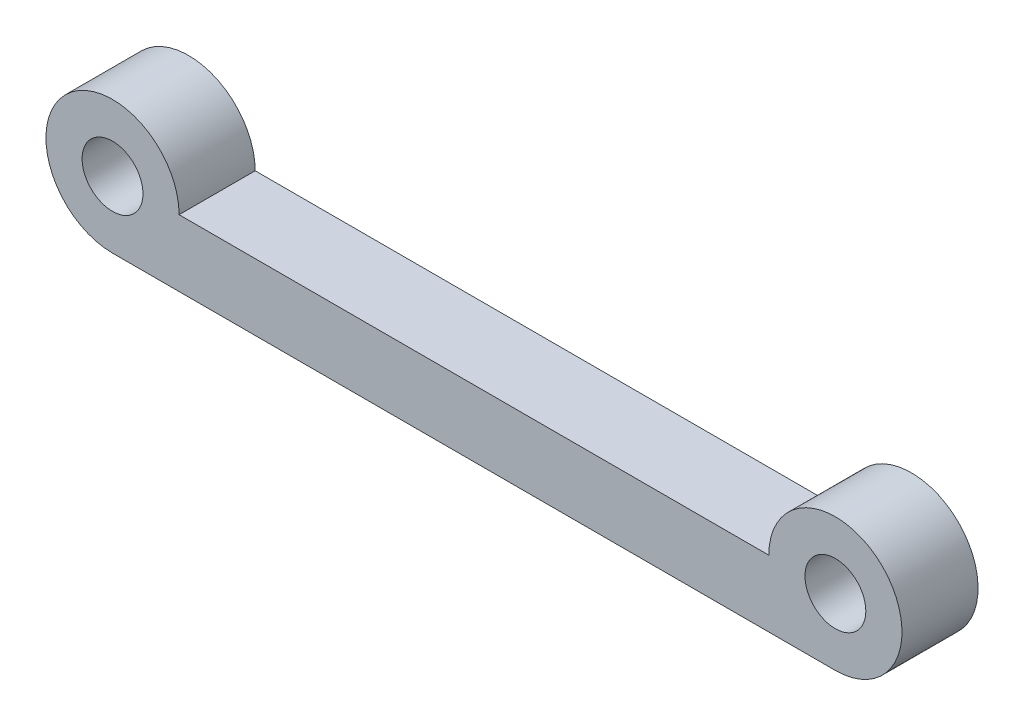
ISO-10303-21;
HEADER;
FILE_DESCRIPTION(('STEP AP214'),'2;1');
FILE_NAME('part.step','',(''),(''),'','','');
FILE_SCHEMA(('AUTOMOTIVE_DESIGN { 1 0 10303 214 1 1 1 1 }'));
ENDSEC;
DATA;
#1=APPLICATION_CONTEXT('core data for automotive mechanical design processes');
#2=APPLICATION_PROTOCOL_DEFINITION('international standard','automotive_design',2000,#1);
#3=PRODUCT_CONTEXT('',#1,'mechanical');
#4=PRODUCT('Part','Part','',(#3));
#5=PRODUCT_RELATED_PRODUCT_CATEGORY('part','',(#4));
#6=PRODUCT_DEFINITION_FORMATION('','',#4);
#7=PRODUCT_DEFINITION_CONTEXT('part definition',#1,'design');
#8=PRODUCT_DEFINITION('design','',#6,#7);
#9=PRODUCT_DEFINITION_SHAPE('','',#8);
#10=(LENGTH_UNIT() NAMED_UNIT(*) SI_UNIT(.MILLI.,.METRE.));
#11=(NAMED_UNIT(*) PLANE_ANGLE_UNIT() SI_UNIT($,.RADIAN.));
#12=(NAMED_UNIT(*) SI_UNIT($,.STERADIAN.) SOLID_ANGLE_UNIT());
#13=UNCERTAINTY_MEASURE_WITH_UNIT(LENGTH_MEASURE(1.E-05),#10,'distance_accuracy_value','');
#14=(GEOMETRIC_REPRESENTATION_CONTEXT(3) GLOBAL_UNCERTAINTY_ASSIGNED_CONTEXT((#13)) GLOBAL_UNIT_ASSIGNED_CONTEXT((#10,
#11,#12)) REPRESENTATION_CONTEXT('',''));
#15=CARTESIAN_POINT('',(0.,0.,0.));
#16=DIRECTION('',(0.,0.,1.));
#17=DIRECTION('',(1.,0.,0.));
#18=AXIS2_PLACEMENT_3D('',#15,#16,#17);
#19=CARTESIAN_POINT('',(0.,0.,4.));
#20=DIRECTION('',(0.,0.,1.));
#21=DIRECTION('',(1.,0.,0.));
#22=AXIS2_PLACEMENT_3D('',#19,#20,#21);
#23=PLANE('',#22);
#24=CARTESIAN_POINT('',(0.,0.,4.));
#25=DIRECTION('',(0.,0.,1.));
#26=DIRECTION('',(1.,0.,0.));
#27=AXIS2_PLACEMENT_3D('',#24,#25,#26);
#28=CIRCLE('',#27,1.6);
#29=CARTESIAN_POINT('',(1.6,0.,4.));
#30=VERTEX_POINT('',#29);
#31=EDGE_CURVE('E100',#30,#30,#28,.T.);
#32=ORIENTED_EDGE('',*,*,#31,.F.);
#33=EDGE_LOOP('',(#32));
#34=FACE_BOUND('',#33,.T.);
#35=CARTESIAN_POINT('',(0.,0.,4.));
#36=DIRECTION('',(0.,0.,1.));
#37=DIRECTION('',(1.,0.,0.));
#38=AXIS2_PLACEMENT_3D('',#35,#36,#37);
#39=CIRCLE('',#38,3.5);
#40=CARTESIAN_POINT('',(3.5,0.,4.));
#41=VERTEX_POINT('',#40);
#42=CARTESIAN_POINT('',(0.,-3.5,4.));
#43=VERTEX_POINT('',#42);
#44=EDGE_CURVE('E85',#41,#43,#39,.T.);
#45=ORIENTED_EDGE('',*,*,#44,.T.);
#46=DIRECTION('',(1.,0.,0.));
#47=VECTOR('',#46,1.);
#48=CARTESIAN_POINT('',(0.,-3.5,4.));
#49=LINE('',#48,#47);
#50=CARTESIAN_POINT('',(38.,-3.5,4.));
#51=VERTEX_POINT('',#50);
#52=EDGE_CURVE('E80',#43,#51,#49,.T.);
#53=ORIENTED_EDGE('',*,*,#52,.T.);
#54=CARTESIAN_POINT('',(38.,0.,4.));
#55=DIRECTION('',(0.,0.,1.));
#56=DIRECTION('',(1.,0.,0.));
#57=AXIS2_PLACEMENT_3D('',#54,#55,#56);
#58=CIRCLE('',#57,3.5);
#59=CARTESIAN_POINT('',(34.5,0.,4.));
#60=VERTEX_POINT('',#59);
#61=EDGE_CURVE('E83',#51,#60,#58,.T.);
#62=ORIENTED_EDGE('',*,*,#61,.T.);
#63=DIRECTION('',(-1.,0.,0.));
#64=VECTOR('',#63,1.);
#65=CARTESIAN_POINT('',(3.5,0.,4.));
#66=LINE('',#65,#64);
#67=EDGE_CURVE('E50',#60,#41,#66,.T.);
#68=ORIENTED_EDGE('',*,*,#67,.T.);
#69=EDGE_LOOP('',(#45,#53,#62,#68));
#70=FACE_BOUND('',#69,.T.);
#71=CARTESIAN_POINT('',(38.,0.,4.));
#72=DIRECTION('',(0.,0.,1.));
#73=DIRECTION('',(1.,0.,0.));
#74=AXIS2_PLACEMENT_3D('',#71,#72,#73);
#75=CIRCLE('',#74,1.6);
#76=CARTESIAN_POINT('',(39.6,0.,4.));
#77=VERTEX_POINT('',#76);
#78=EDGE_CURVE('E115',#77,#77,#75,.T.);
#79=ORIENTED_EDGE('',*,*,#78,.F.);
#80=EDGE_LOOP('',(#79));
#81=FACE_BOUND('',#80,.T.);
#82=ADVANCED_FACE('F33',(#34,#70,#81),#23,.T.);
#83=CARTESIAN_POINT('',(0.,0.,0.));
#84=DIRECTION('',(0.,0.,1.));
#85=DIRECTION('',(1.,0.,0.));
#86=AXIS2_PLACEMENT_3D('',#83,#84,#85);
#87=PLANE('',#86);
#88=CARTESIAN_POINT('',(0.,0.,0.));
#89=DIRECTION('',(0.,0.,1.));
#90=DIRECTION('',(1.,0.,0.));
#91=AXIS2_PLACEMENT_3D('',#88,#89,#90);
#92=CIRCLE('',#91,3.5);
#93=CARTESIAN_POINT('',(3.5,0.,0.));
#94=VERTEX_POINT('',#93);
#95=CARTESIAN_POINT('',(0.,-3.5,0.));
#96=VERTEX_POINT('',#95);
#97=EDGE_CURVE('E97',#94,#96,#92,.T.);
#98=ORIENTED_EDGE('',*,*,#97,.F.);
#99=DIRECTION('',(-1.,0.,0.));
#100=VECTOR('',#99,1.);
#101=CARTESIAN_POINT('',(3.5,0.,0.));
#102=LINE('',#101,#100);
#103=CARTESIAN_POINT('',(34.5,0.,0.));
#104=VERTEX_POINT('',#103);
#105=EDGE_CURVE('E73',#104,#94,#102,.T.);
#106=ORIENTED_EDGE('',*,*,#105,.F.);
#107=CARTESIAN_POINT('',(38.,0.,0.));
#108=DIRECTION('',(0.,0.,1.));
#109=DIRECTION('',(1.,0.,0.));
#110=AXIS2_PLACEMENT_3D('',#107,#108,#109);
#111=CIRCLE('',#110,3.5);
#112=CARTESIAN_POINT('',(38.,-3.5,0.));
#113=VERTEX_POINT('',#112);
#114=EDGE_CURVE('E67',#113,#104,#111,.T.);
#115=ORIENTED_EDGE('',*,*,#114,.F.);
#116=DIRECTION('',(1.,0.,0.));
#117=VECTOR('',#116,1.);
#118=CARTESIAN_POINT('',(0.,-3.5,0.));
#119=LINE('',#118,#117);
#120=EDGE_CURVE('E89',#96,#113,#119,.T.);
#121=ORIENTED_EDGE('',*,*,#120,.F.);
#122=EDGE_LOOP('',(#98,#106,#115,#121));
#123=FACE_BOUND('',#122,.T.);
#124=CARTESIAN_POINT('',(0.,0.,0.));
#125=DIRECTION('',(0.,0.,1.));
#126=DIRECTION('',(1.,0.,0.));
#127=AXIS2_PLACEMENT_3D('',#124,#125,#126);
#128=CIRCLE('',#127,1.6);
#129=CARTESIAN_POINT('',(1.6,0.,0.));
#130=VERTEX_POINT('',#129);
#131=EDGE_CURVE('E112',#130,#130,#128,.T.);
#132=ORIENTED_EDGE('',*,*,#131,.T.);
#133=EDGE_LOOP('',(#132));
#134=FACE_BOUND('',#133,.T.);
#135=CARTESIAN_POINT('',(38.,0.,0.));
#136=DIRECTION('',(0.,0.,1.));
#137=DIRECTION('',(1.,0.,0.));
#138=AXIS2_PLACEMENT_3D('',#135,#136,#137);
#139=CIRCLE('',#138,1.6);
#140=CARTESIAN_POINT('',(39.6,0.,0.));
#141=VERTEX_POINT('',#140);
#142=EDGE_CURVE('E118',#141,#141,#139,.T.);
#143=ORIENTED_EDGE('',*,*,#142,.T.);
#144=EDGE_LOOP('',(#143));
#145=FACE_BOUND('',#144,.T.);
#146=ADVANCED_FACE('F108',(#123,#134,#145),#87,.F.);
#147=CARTESIAN_POINT('',(0.,0.,4.));
#148=DIRECTION('',(0.,0.,-1.));
#149=DIRECTION('',(-1.,0.,0.));
#150=AXIS2_PLACEMENT_3D('',#147,#148,#149);
#151=CYLINDRICAL_SURFACE('',#150,3.5);
#152=ORIENTED_EDGE('',*,*,#97,.T.);
#153=DIRECTION('',(0.,0.,-1.));
#154=VECTOR('',#153,1.);
#155=CARTESIAN_POINT('',(0.,-3.5,4.));
#156=LINE('',#155,#154);
#157=EDGE_CURVE('E11',#43,#96,#156,.T.);
#158=ORIENTED_EDGE('',*,*,#157,.F.);
#159=ORIENTED_EDGE('',*,*,#44,.F.);
#160=DIRECTION('',(0.,0.,-1.));
#161=VECTOR('',#160,1.);
#162=CARTESIAN_POINT('',(3.5,0.,4.));
#163=LINE('',#162,#161);
#164=EDGE_CURVE('E93',#41,#94,#163,.T.);
#165=ORIENTED_EDGE('',*,*,#164,.T.);
#166=EDGE_LOOP('',(#152,#158,#159,#165));
#167=FACE_BOUND('',#166,.T.);
#168=ADVANCED_FACE('F35',(#167),#151,.T.);
#169=CARTESIAN_POINT('',(0.,-3.5,4.));
#170=DIRECTION('',(0.,1.,0.));
#171=DIRECTION('',(0.,0.,1.));
#172=AXIS2_PLACEMENT_3D('',#169,#170,#171);
#173=PLANE('',#172);
#174=ORIENTED_EDGE('',*,*,#120,.T.);
#175=DIRECTION('',(0.,0.,-1.));
#176=VECTOR('',#175,1.);
#177=CARTESIAN_POINT('',(38.,-3.5,4.));
#178=LINE('',#177,#176);
#179=EDGE_CURVE('E42',#51,#113,#178,.T.);
#180=ORIENTED_EDGE('',*,*,#179,.F.);
#181=ORIENTED_EDGE('',*,*,#52,.F.);
#182=ORIENTED_EDGE('',*,*,#157,.T.);
#183=EDGE_LOOP('',(#174,#180,#181,#182));
#184=FACE_BOUND('',#183,.T.);
#185=ADVANCED_FACE('F88',(#184),#173,.F.);
#186=CARTESIAN_POINT('',(38.,0.,4.));
#187=DIRECTION('',(0.,0.,-1.));
#188=DIRECTION('',(-1.,0.,0.));
#189=AXIS2_PLACEMENT_3D('',#186,#187,#188);
#190=CYLINDRICAL_SURFACE('',#189,3.5);
#191=ORIENTED_EDGE('',*,*,#114,.T.);
#192=DIRECTION('',(0.,0.,-1.));
#193=VECTOR('',#192,1.);
#194=CARTESIAN_POINT('',(34.5,0.,4.));
#195=LINE('',#194,#193);
#196=EDGE_CURVE('E90',#60,#104,#195,.T.);
#197=ORIENTED_EDGE('',*,*,#196,.F.);
#198=ORIENTED_EDGE('',*,*,#61,.F.);
#199=ORIENTED_EDGE('',*,*,#179,.T.);
#200=EDGE_LOOP('',(#191,#197,#198,#199));
#201=FACE_BOUND('',#200,.T.);
#202=ADVANCED_FACE('F91',(#201),#190,.T.);
#203=CARTESIAN_POINT('',(3.5,0.,4.));
#204=DIRECTION('',(0.,-1.,0.));
#205=DIRECTION('',(1.,0.,0.));
#206=AXIS2_PLACEMENT_3D('',#203,#204,#205);
#207=PLANE('',#206);
#208=ORIENTED_EDGE('',*,*,#105,.T.);
#209=ORIENTED_EDGE('',*,*,#164,.F.);
#210=ORIENTED_EDGE('',*,*,#67,.F.);
#211=ORIENTED_EDGE('',*,*,#196,.T.);
#212=EDGE_LOOP('',(#208,#209,#210,#211));
#213=FACE_BOUND('',#212,.T.);
#214=ADVANCED_FACE('F105',(#213),#207,.F.);
#215=CARTESIAN_POINT('',(0.,0.,4.));
#216=DIRECTION('',(0.,0.,-1.));
#217=DIRECTION('',(-1.,0.,0.));
#218=AXIS2_PLACEMENT_3D('',#215,#216,#217);
#219=CYLINDRICAL_SURFACE('',#218,1.6);
#220=ORIENTED_EDGE('',*,*,#31,.T.);
#221=EDGE_LOOP('',(#220));
#222=FACE_BOUND('',#221,.T.);
#223=ORIENTED_EDGE('',*,*,#131,.F.);
#224=EDGE_LOOP('',(#223));
#225=FACE_BOUND('',#224,.T.);
#226=ADVANCED_FACE('F135',(#222,#225),#219,.F.);
#227=CARTESIAN_POINT('',(38.,0.,4.));
#228=DIRECTION('',(0.,0.,-1.));
#229=DIRECTION('',(-1.,0.,0.));
#230=AXIS2_PLACEMENT_3D('',#227,#228,#229);
#231=CYLINDRICAL_SURFACE('',#230,1.6);
#232=ORIENTED_EDGE('',*,*,#78,.T.);
#233=EDGE_LOOP('',(#232));
#234=FACE_BOUND('',#233,.T.);
#235=ORIENTED_EDGE('',*,*,#142,.F.);
#236=EDGE_LOOP('',(#235));
#237=FACE_BOUND('',#236,.T.);
#238=ADVANCED_FACE('F124',(#234,#237),#231,.F.);
#239=CLOSED_SHELL('',(#82,#146,#168,#185,#202,#214,#226,#238));
#240=MANIFOLD_SOLID_BREP('B2',#239);
#241=ADVANCED_BREP_SHAPE_REPRESENTATION('',(#18,#240),#14);
#242=SHAPE_DEFINITION_REPRESENTATION(#9,#241);
ENDSEC;
END-ISO-10303-21;
